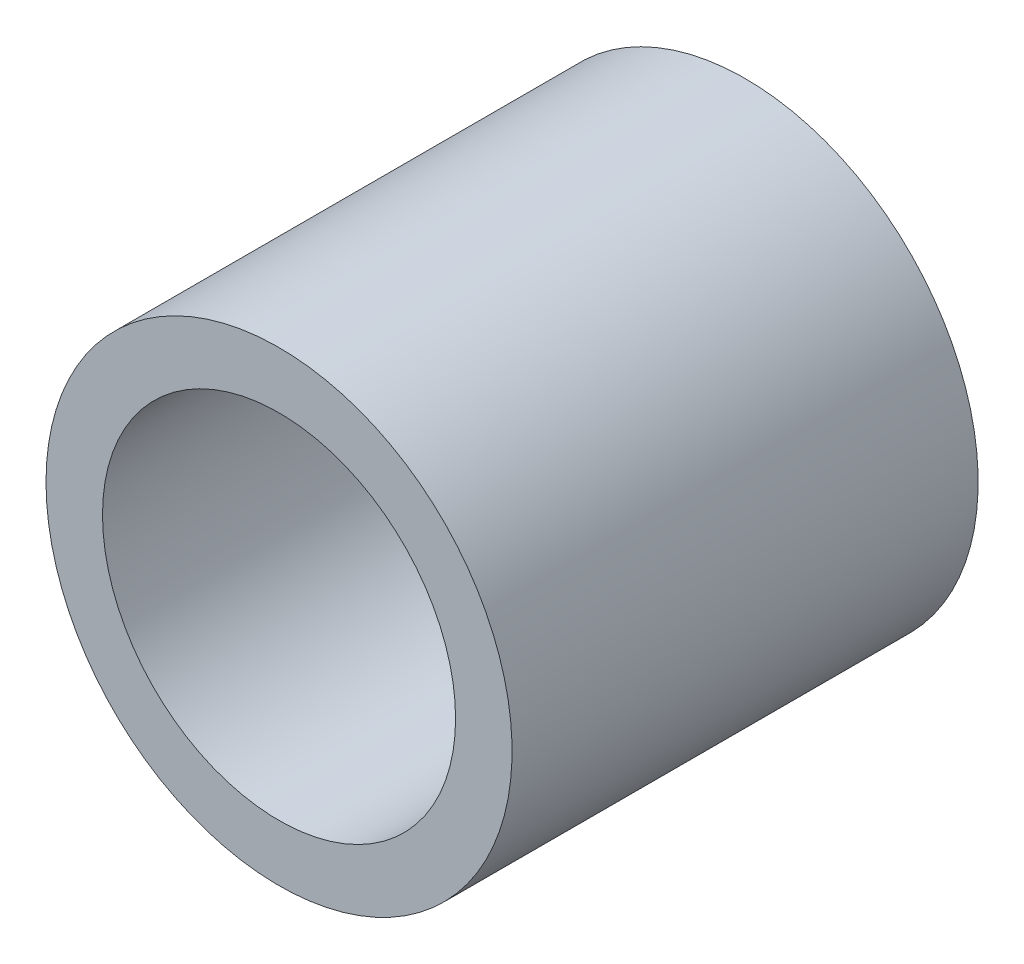
ISO-10303-21;
HEADER;
FILE_DESCRIPTION(('STEP AP214'),'2;1');
FILE_NAME('part.step','',(''),(''),'','','');
FILE_SCHEMA(('AUTOMOTIVE_DESIGN { 1 0 10303 214 1 1 1 1 }'));
ENDSEC;
DATA;
#1=APPLICATION_CONTEXT('core data for automotive mechanical design processes');
#2=APPLICATION_PROTOCOL_DEFINITION('international standard','automotive_design',2000,#1);
#3=PRODUCT_CONTEXT('',#1,'mechanical');
#4=PRODUCT('Part','Part','',(#3));
#5=PRODUCT_RELATED_PRODUCT_CATEGORY('part','',(#4));
#6=PRODUCT_DEFINITION_FORMATION('','',#4);
#7=PRODUCT_DEFINITION_CONTEXT('part definition',#1,'design');
#8=PRODUCT_DEFINITION('design','',#6,#7);
#9=PRODUCT_DEFINITION_SHAPE('','',#8);
#10=(LENGTH_UNIT() NAMED_UNIT(*) SI_UNIT(.MILLI.,.METRE.));
#11=(NAMED_UNIT(*) PLANE_ANGLE_UNIT() SI_UNIT($,.RADIAN.));
#12=(NAMED_UNIT(*) SI_UNIT($,.STERADIAN.) SOLID_ANGLE_UNIT());
#13=UNCERTAINTY_MEASURE_WITH_UNIT(LENGTH_MEASURE(1.E-05),#10,'distance_accuracy_value','');
#14=(GEOMETRIC_REPRESENTATION_CONTEXT(3) GLOBAL_UNCERTAINTY_ASSIGNED_CONTEXT((#13)) GLOBAL_UNIT_ASSIGNED_CONTEXT((#10,
#11,#12)) REPRESENTATION_CONTEXT('',''));
#15=CARTESIAN_POINT('',(0.,0.,0.));
#16=DIRECTION('',(0.,0.,1.));
#17=DIRECTION('',(1.,0.,0.));
#18=AXIS2_PLACEMENT_3D('',#15,#16,#17);
#19=CARTESIAN_POINT('',(0.,0.,9.9));
#20=DIRECTION('',(0.,0.,1.));
#21=DIRECTION('',(1.,0.,0.));
#22=AXIS2_PLACEMENT_3D('',#19,#20,#21);
#23=PLANE('',#22);
#24=CARTESIAN_POINT('',(0.,0.,9.9));
#25=DIRECTION('',(0.,0.,1.));
#26=DIRECTION('',(1.,0.,0.));
#27=AXIS2_PLACEMENT_3D('',#24,#25,#26);
#28=CIRCLE('',#27,4.95);
#29=CARTESIAN_POINT('',(-4.95,0.,9.9));
#30=VERTEX_POINT('',#29);
#31=EDGE_CURVE('E10',#30,#30,#28,.T.);
#32=ORIENTED_EDGE('',*,*,#31,.T.);
#33=EDGE_LOOP('',(#32));
#34=FACE_BOUND('',#33,.T.);
#35=CARTESIAN_POINT('',(0.,0.,9.9));
#36=DIRECTION('',(0.,0.,1.));
#37=DIRECTION('',(1.,0.,0.));
#38=AXIS2_PLACEMENT_3D('',#35,#36,#37);
#39=CIRCLE('',#38,3.75);
#40=CARTESIAN_POINT('',(-3.75,0.,9.9));
#41=VERTEX_POINT('',#40);
#42=EDGE_CURVE('E50',#41,#41,#39,.T.);
#43=ORIENTED_EDGE('',*,*,#42,.F.);
#44=EDGE_LOOP('',(#43));
#45=FACE_BOUND('',#44,.T.);
#46=ADVANCED_FACE('F37',(#34,#45),#23,.T.);
#47=CARTESIAN_POINT('',(0.,0.,0.));
#48=DIRECTION('',(0.,0.,1.));
#49=DIRECTION('',(1.,0.,0.));
#50=AXIS2_PLACEMENT_3D('',#47,#48,#49);
#51=PLANE('',#50);
#52=CARTESIAN_POINT('',(0.,0.,0.));
#53=DIRECTION('',(0.,0.,1.));
#54=DIRECTION('',(1.,0.,0.));
#55=AXIS2_PLACEMENT_3D('',#52,#53,#54);
#56=CIRCLE('',#55,4.95);
#57=CARTESIAN_POINT('',(-4.95,0.,0.));
#58=VERTEX_POINT('',#57);
#59=EDGE_CURVE('E41',#58,#58,#56,.T.);
#60=ORIENTED_EDGE('',*,*,#59,.F.);
#61=EDGE_LOOP('',(#60));
#62=FACE_BOUND('',#61,.T.);
#63=CARTESIAN_POINT('',(0.,0.,0.));
#64=DIRECTION('',(0.,0.,1.));
#65=DIRECTION('',(1.,0.,0.));
#66=AXIS2_PLACEMENT_3D('',#63,#64,#65);
#67=CIRCLE('',#66,3.75);
#68=CARTESIAN_POINT('',(-3.75,0.,0.));
#69=VERTEX_POINT('',#68);
#70=EDGE_CURVE('E52',#69,#69,#67,.T.);
#71=ORIENTED_EDGE('',*,*,#70,.T.);
#72=EDGE_LOOP('',(#71));
#73=FACE_BOUND('',#72,.T.);
#74=ADVANCED_FACE('F64',(#62,#73),#51,.F.);
#75=CARTESIAN_POINT('',(0.,0.,9.9));
#76=DIRECTION('',(0.,0.,-1.));
#77=DIRECTION('',(-1.,0.,0.));
#78=AXIS2_PLACEMENT_3D('',#75,#76,#77);
#79=CYLINDRICAL_SURFACE('',#78,4.95);
#80=CARTESIAN_POINT('',(-4.95,0.,9.9));
#81=CARTESIAN_POINT('',(-4.95,0.,9.796875));
#82=CARTESIAN_POINT('',(-4.95,0.,9.69375));
#83=CARTESIAN_POINT('',(-4.95,0.,9.4875));
#84=CARTESIAN_POINT('',(-4.95,0.,9.384375));
#85=CARTESIAN_POINT('',(-4.95,0.,9.178125));
#86=CARTESIAN_POINT('',(-4.95,0.,9.075));
#87=CARTESIAN_POINT('',(-4.95,0.,8.86875));
#88=CARTESIAN_POINT('',(-4.95,0.,8.765625));
#89=CARTESIAN_POINT('',(-4.95,0.,8.559375));
#90=CARTESIAN_POINT('',(-4.95,0.,8.45625));
#91=CARTESIAN_POINT('',(-4.95,0.,8.25));
#92=CARTESIAN_POINT('',(-4.95,0.,8.146875));
#93=CARTESIAN_POINT('',(-4.95,0.,7.940625));
#94=CARTESIAN_POINT('',(-4.95,0.,7.8375));
#95=CARTESIAN_POINT('',(-4.95,0.,7.63125));
#96=CARTESIAN_POINT('',(-4.95,0.,7.528125));
#97=CARTESIAN_POINT('',(-4.95,0.,7.321875));
#98=CARTESIAN_POINT('',(-4.95,0.,7.21875));
#99=CARTESIAN_POINT('',(-4.95,0.,7.0125));
#100=CARTESIAN_POINT('',(-4.95,0.,6.909375));
#101=CARTESIAN_POINT('',(-4.95,0.,6.703125));
#102=CARTESIAN_POINT('',(-4.95,0.,6.6));
#103=CARTESIAN_POINT('',(-4.95,0.,6.39375));
#104=CARTESIAN_POINT('',(-4.95,0.,6.290625));
#105=CARTESIAN_POINT('',(-4.95,0.,6.084375));
#106=CARTESIAN_POINT('',(-4.95,0.,5.98125));
#107=CARTESIAN_POINT('',(-4.95,0.,5.775));
#108=CARTESIAN_POINT('',(-4.95,0.,5.671875));
#109=CARTESIAN_POINT('',(-4.95,0.,5.465625));
#110=CARTESIAN_POINT('',(-4.95,0.,5.3625));
#111=CARTESIAN_POINT('',(-4.95,0.,5.15625));
#112=CARTESIAN_POINT('',(-4.95,0.,5.053125));
#113=CARTESIAN_POINT('',(-4.95,0.,4.846875));
#114=CARTESIAN_POINT('',(-4.95,0.,4.74375));
#115=CARTESIAN_POINT('',(-4.95,0.,4.5375));
#116=CARTESIAN_POINT('',(-4.95,0.,4.434375));
#117=CARTESIAN_POINT('',(-4.95,0.,4.228125));
#118=CARTESIAN_POINT('',(-4.95,0.,4.125));
#119=CARTESIAN_POINT('',(-4.95,0.,3.91875));
#120=CARTESIAN_POINT('',(-4.95,0.,3.815625));
#121=CARTESIAN_POINT('',(-4.95,0.,3.609375));
#122=CARTESIAN_POINT('',(-4.95,0.,3.50625));
#123=CARTESIAN_POINT('',(-4.95,0.,3.3));
#124=CARTESIAN_POINT('',(-4.95,0.,3.196875));
#125=CARTESIAN_POINT('',(-4.95,0.,2.990625));
#126=CARTESIAN_POINT('',(-4.95,0.,2.8875));
#127=CARTESIAN_POINT('',(-4.95,0.,2.68125));
#128=CARTESIAN_POINT('',(-4.95,0.,2.578125));
#129=CARTESIAN_POINT('',(-4.95,0.,2.371875));
#130=CARTESIAN_POINT('',(-4.95,0.,2.26875));
#131=CARTESIAN_POINT('',(-4.95,0.,2.0625));
#132=CARTESIAN_POINT('',(-4.95,0.,1.959375));
#133=CARTESIAN_POINT('',(-4.95,0.,1.753125));
#134=CARTESIAN_POINT('',(-4.95,0.,1.65));
#135=CARTESIAN_POINT('',(-4.95,0.,1.44375));
#136=CARTESIAN_POINT('',(-4.95,0.,1.340625));
#137=CARTESIAN_POINT('',(-4.95,0.,1.134375));
#138=CARTESIAN_POINT('',(-4.95,0.,1.03125));
#139=CARTESIAN_POINT('',(-4.95,0.,0.825));
#140=CARTESIAN_POINT('',(-4.95,0.,0.721875));
#141=CARTESIAN_POINT('',(-4.95,0.,0.515625));
#142=CARTESIAN_POINT('',(-4.95,0.,0.4125));
#143=CARTESIAN_POINT('',(-4.95,0.,0.20625));
#144=CARTESIAN_POINT('',(-4.95,0.,0.103125));
#145=CARTESIAN_POINT('',(-4.95,0.,0.));
#146=B_SPLINE_CURVE_WITH_KNOTS('',3,(#80,#81,#82,#83,#84,#85,#86,#87,#88,#89,#90,#91,#92,#93,
#94,#95,#96,#97,#98,#99,#100,#101,#102,#103,#104,#105,#106,#107,#108,#109,#110,#111,#112,#113,
#114,#115,#116,#117,#118,#119,#120,#121,#122,#123,#124,#125,#126,#127,#128,#129,#130,#131,#132,
#133,#134,#135,#136,#137,#138,#139,#140,#141,#142,#143,#144,#145),.UNSPECIFIED.,.F.,.F.,(4,2,2,
2,2,2,2,2,2,2,2,2,2,2,2,2,2,2,2,2,2,2,2,2,2,2,2,2,2,2,2,2,4),(0.,0.309374999999999,
0.618749999999999,0.928124999999998,1.2375,1.546875,1.85625,2.165625,2.475,2.784375,3.09375,
3.403125,3.7125,4.021875,4.33125,4.640625,4.95,5.259375,5.56875,5.878125,6.1875,6.496875,
6.80625,7.115625,7.425,7.734375,8.04375,8.353125,8.6625,8.971875,9.28125,9.590625,9.9),.UNSPECIFIED.);
#147=EDGE_CURVE('BSEAM39',#30,#58,#146,.T.);
#148=ORIENTED_EDGE('',*,*,#31,.F.);
#149=ORIENTED_EDGE('',*,*,#59,.T.);
#150=ORIENTED_EDGE('',*,*,#147,.T.);
#151=ORIENTED_EDGE('',*,*,#147,.F.);
#152=EDGE_LOOP('',(#148,#150,#149,#151));
#153=FACE_BOUND('',#152,.T.);
#154=ADVANCED_FACE('F39',(#153),#79,.T.);
#155=CARTESIAN_POINT('',(0.,0.,9.9));
#156=DIRECTION('',(0.,0.,-1.));
#157=DIRECTION('',(-1.,0.,0.));
#158=AXIS2_PLACEMENT_3D('',#155,#156,#157);
#159=CYLINDRICAL_SURFACE('',#158,3.75);
#160=CARTESIAN_POINT('',(-3.75,0.,9.9));
#161=CARTESIAN_POINT('',(-3.75,0.,9.796875));
#162=CARTESIAN_POINT('',(-3.75,0.,9.69375));
#163=CARTESIAN_POINT('',(-3.75,0.,9.4875));
#164=CARTESIAN_POINT('',(-3.75,0.,9.384375));
#165=CARTESIAN_POINT('',(-3.75,0.,9.178125));
#166=CARTESIAN_POINT('',(-3.75,0.,9.075));
#167=CARTESIAN_POINT('',(-3.75,0.,8.86875));
#168=CARTESIAN_POINT('',(-3.75,0.,8.765625));
#169=CARTESIAN_POINT('',(-3.75,0.,8.559375));
#170=CARTESIAN_POINT('',(-3.75,0.,8.45625));
#171=CARTESIAN_POINT('',(-3.75,0.,8.25));
#172=CARTESIAN_POINT('',(-3.75,0.,8.146875));
#173=CARTESIAN_POINT('',(-3.75,0.,7.940625));
#174=CARTESIAN_POINT('',(-3.75,0.,7.8375));
#175=CARTESIAN_POINT('',(-3.75,0.,7.63125));
#176=CARTESIAN_POINT('',(-3.75,0.,7.528125));
#177=CARTESIAN_POINT('',(-3.75,0.,7.321875));
#178=CARTESIAN_POINT('',(-3.75,0.,7.21875));
#179=CARTESIAN_POINT('',(-3.75,0.,7.0125));
#180=CARTESIAN_POINT('',(-3.75,0.,6.909375));
#181=CARTESIAN_POINT('',(-3.75,0.,6.703125));
#182=CARTESIAN_POINT('',(-3.75,0.,6.6));
#183=CARTESIAN_POINT('',(-3.75,0.,6.39375));
#184=CARTESIAN_POINT('',(-3.75,0.,6.290625));
#185=CARTESIAN_POINT('',(-3.75,0.,6.084375));
#186=CARTESIAN_POINT('',(-3.75,0.,5.98125));
#187=CARTESIAN_POINT('',(-3.75,0.,5.775));
#188=CARTESIAN_POINT('',(-3.75,0.,5.671875));
#189=CARTESIAN_POINT('',(-3.75,0.,5.465625));
#190=CARTESIAN_POINT('',(-3.75,0.,5.3625));
#191=CARTESIAN_POINT('',(-3.75,0.,5.15625));
#192=CARTESIAN_POINT('',(-3.75,0.,5.053125));
#193=CARTESIAN_POINT('',(-3.75,0.,4.846875));
#194=CARTESIAN_POINT('',(-3.75,0.,4.74375));
#195=CARTESIAN_POINT('',(-3.75,0.,4.5375));
#196=CARTESIAN_POINT('',(-3.75,0.,4.434375));
#197=CARTESIAN_POINT('',(-3.75,0.,4.228125));
#198=CARTESIAN_POINT('',(-3.75,0.,4.125));
#199=CARTESIAN_POINT('',(-3.75,0.,3.91875));
#200=CARTESIAN_POINT('',(-3.75,0.,3.815625));
#201=CARTESIAN_POINT('',(-3.75,0.,3.609375));
#202=CARTESIAN_POINT('',(-3.75,0.,3.50625));
#203=CARTESIAN_POINT('',(-3.75,0.,3.3));
#204=CARTESIAN_POINT('',(-3.75,0.,3.196875));
#205=CARTESIAN_POINT('',(-3.75,0.,2.990625));
#206=CARTESIAN_POINT('',(-3.75,0.,2.8875));
#207=CARTESIAN_POINT('',(-3.75,0.,2.68125));
#208=CARTESIAN_POINT('',(-3.75,0.,2.578125));
#209=CARTESIAN_POINT('',(-3.75,0.,2.371875));
#210=CARTESIAN_POINT('',(-3.75,0.,2.26875));
#211=CARTESIAN_POINT('',(-3.75,0.,2.0625));
#212=CARTESIAN_POINT('',(-3.75,0.,1.959375));
#213=CARTESIAN_POINT('',(-3.75,0.,1.753125));
#214=CARTESIAN_POINT('',(-3.75,0.,1.65));
#215=CARTESIAN_POINT('',(-3.75,0.,1.44375));
#216=CARTESIAN_POINT('',(-3.75,0.,1.340625));
#217=CARTESIAN_POINT('',(-3.75,0.,1.134375));
#218=CARTESIAN_POINT('',(-3.75,0.,1.03125));
#219=CARTESIAN_POINT('',(-3.75,0.,0.825));
#220=CARTESIAN_POINT('',(-3.75,0.,0.721875));
#221=CARTESIAN_POINT('',(-3.75,0.,0.515625));
#222=CARTESIAN_POINT('',(-3.75,0.,0.4125));
#223=CARTESIAN_POINT('',(-3.75,0.,0.20625));
#224=CARTESIAN_POINT('',(-3.75,0.,0.103125));
#225=CARTESIAN_POINT('',(-3.75,0.,0.));
#226=B_SPLINE_CURVE_WITH_KNOTS('',3,(#160,#161,#162,#163,#164,#165,#166,#167,#168,#169,#170,
#171,#172,#173,#174,#175,#176,#177,#178,#179,#180,#181,#182,#183,#184,#185,#186,#187,#188,#189,
#190,#191,#192,#193,#194,#195,#196,#197,#198,#199,#200,#201,#202,#203,#204,#205,#206,#207,#208,
#209,#210,#211,#212,#213,#214,#215,#216,#217,#218,#219,#220,#221,#222,#223,#224,#225),
.UNSPECIFIED.,.F.,.F.,(4,2,2,2,2,2,2,2,2,2,2,2,2,2,2,2,2,2,2,2,2,2,2,2,2,2,2,2,2,2,2,2,4),(0.,
0.309374999999999,0.618749999999999,0.928124999999998,1.2375,1.546875,1.85625,2.165625,2.475,
2.784375,3.09375,3.403125,3.7125,4.021875,4.33125,4.640625,4.95,5.259375,5.56875,5.878125,
6.1875,6.496875,6.80625,7.115625,7.425,7.734375,8.04375,8.353125,8.6625,8.971875,9.28125,
9.590625,9.9),.UNSPECIFIED.);
#227=EDGE_CURVE('BSEAM60',#41,#69,#226,.T.);
#228=ORIENTED_EDGE('',*,*,#42,.T.);
#229=ORIENTED_EDGE('',*,*,#70,.F.);
#230=ORIENTED_EDGE('',*,*,#227,.T.);
#231=ORIENTED_EDGE('',*,*,#227,.F.);
#232=EDGE_LOOP('',(#228,#230,#229,#231));
#233=FACE_BOUND('',#232,.T.);
#234=ADVANCED_FACE('F60',(#233),#159,.F.);
#235=CLOSED_SHELL('',(#46,#74,#154,#234));
#236=MANIFOLD_SOLID_BREP('B2',#235);
#237=ADVANCED_BREP_SHAPE_REPRESENTATION('',(#18,#236),#14);
#238=SHAPE_DEFINITION_REPRESENTATION(#9,#237);
ENDSEC;
END-ISO-10303-21;
